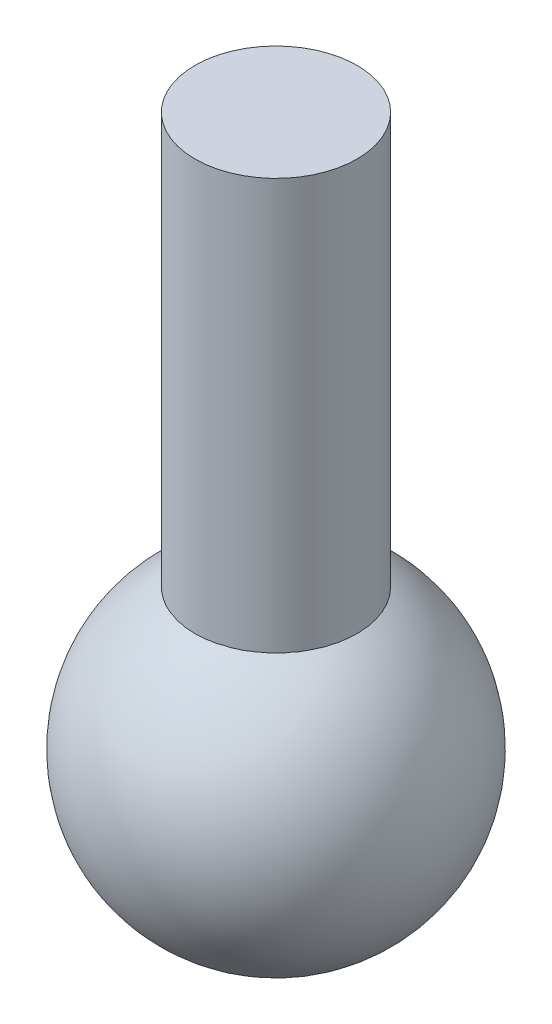
ISO-10303-21;
HEADER;
FILE_DESCRIPTION(('STEP AP214'),'2;1');
FILE_NAME('part.step','',(''),(''),'','','');
FILE_SCHEMA(('AUTOMOTIVE_DESIGN { 1 0 10303 214 1 1 1 1 }'));
ENDSEC;
DATA;
#1=APPLICATION_CONTEXT('core data for automotive mechanical design processes');
#2=APPLICATION_PROTOCOL_DEFINITION('international standard','automotive_design',2000,#1);
#3=PRODUCT_CONTEXT('',#1,'mechanical');
#4=PRODUCT('Part','Part','',(#3));
#5=PRODUCT_RELATED_PRODUCT_CATEGORY('part','',(#4));
#6=PRODUCT_DEFINITION_FORMATION('','',#4);
#7=PRODUCT_DEFINITION_CONTEXT('part definition',#1,'design');
#8=PRODUCT_DEFINITION('design','',#6,#7);
#9=PRODUCT_DEFINITION_SHAPE('','',#8);
#10=(LENGTH_UNIT() NAMED_UNIT(*) SI_UNIT(.MILLI.,.METRE.));
#11=(NAMED_UNIT(*) PLANE_ANGLE_UNIT() SI_UNIT($,.RADIAN.));
#12=(NAMED_UNIT(*) SI_UNIT($,.STERADIAN.) SOLID_ANGLE_UNIT());
#13=UNCERTAINTY_MEASURE_WITH_UNIT(LENGTH_MEASURE(1.E-05),#10,'distance_accuracy_value','');
#14=(GEOMETRIC_REPRESENTATION_CONTEXT(3) GLOBAL_UNCERTAINTY_ASSIGNED_CONTEXT((#13)) GLOBAL_UNIT_ASSIGNED_CONTEXT((#10,
#11,#12)) REPRESENTATION_CONTEXT('',''));
#15=CARTESIAN_POINT('',(0.,0.,0.));
#16=DIRECTION('',(0.,0.,1.));
#17=DIRECTION('',(1.,0.,0.));
#18=AXIS2_PLACEMENT_3D('',#15,#16,#17);
#19=CARTESIAN_POINT('',(0.,-26.,0.));
#20=DIRECTION('',(0.,0.,1.));
#21=DIRECTION('',(1.,0.,0.));
#22=AXIS2_PLACEMENT_3D('',#19,#20,#21);
#23=SPHERICAL_SURFACE('',#22,10.);
#24=CARTESIAN_POINT('',(0.,-26.,10.));
#25=VERTEX_POINT('',#24);
#26=VERTEX_LOOP('',#25);
#27=FACE_BOUND('',#26,.T.);
#28=ADVANCED_FACE('F43',(#27),#23,.T.);
#29=CLOSED_SHELL('',(#28));
#30=MANIFOLD_SOLID_BREP('B2',#29);
#31=CARTESIAN_POINT('',(0.,-26.,0.));
#32=DIRECTION('',(0.,1.,0.));
#33=DIRECTION('',(0.,0.,1.));
#34=AXIS2_PLACEMENT_3D('',#31,#32,#33);
#35=CYLINDRICAL_SURFACE('',#34,5.);
#36=CARTESIAN_POINT('',(0.,-26.,0.));
#37=DIRECTION('',(0.,1.,0.));
#38=DIRECTION('',(0.,0.,1.));
#39=AXIS2_PLACEMENT_3D('',#36,#37,#38);
#40=CIRCLE('',#39,5.);
#41=CARTESIAN_POINT('',(0.,-26.,5.));
#42=VERTEX_POINT('',#41);
#43=EDGE_CURVE('E42',#42,#42,#40,.T.);
#44=ORIENTED_EDGE('',*,*,#43,.T.);
#45=EDGE_LOOP('',(#44));
#46=FACE_BOUND('',#45,.T.);
#47=CARTESIAN_POINT('',(0.,8.,0.));
#48=DIRECTION('',(0.,1.,0.));
#49=DIRECTION('',(0.,0.,1.));
#50=AXIS2_PLACEMENT_3D('',#47,#48,#49);
#51=CIRCLE('',#50,5.);
#52=CARTESIAN_POINT('',(0.,8.,5.));
#53=VERTEX_POINT('',#52);
#54=EDGE_CURVE('E63',#53,#53,#51,.T.);
#55=ORIENTED_EDGE('',*,*,#54,.F.);
#56=EDGE_LOOP('',(#55));
#57=FACE_BOUND('',#56,.T.);
#58=ADVANCED_FACE('F56',(#46,#57),#35,.T.);
#59=CARTESIAN_POINT('',(0.,-26.,0.));
#60=DIRECTION('',(0.,1.,0.));
#61=DIRECTION('',(0.,0.,1.));
#62=AXIS2_PLACEMENT_3D('',#59,#60,#61);
#63=PLANE('',#62);
#64=ORIENTED_EDGE('',*,*,#43,.F.);
#65=EDGE_LOOP('',(#64));
#66=FACE_BOUND('',#65,.T.);
#67=ADVANCED_FACE('F71',(#66),#63,.F.);
#68=CARTESIAN_POINT('',(0.,8.,0.));
#69=DIRECTION('',(0.,1.,0.));
#70=DIRECTION('',(0.,0.,1.));
#71=AXIS2_PLACEMENT_3D('',#68,#69,#70);
#72=PLANE('',#71);
#73=ORIENTED_EDGE('',*,*,#54,.T.);
#74=EDGE_LOOP('',(#73));
#75=FACE_BOUND('',#74,.T.);
#76=ADVANCED_FACE('F58',(#75),#72,.T.);
#77=CLOSED_SHELL('',(#58,#67,#76));
#78=MANIFOLD_SOLID_BREP('B6',#77);
#79=ADVANCED_BREP_SHAPE_REPRESENTATION('',(#18,#30,#78),#14);
#80=SHAPE_DEFINITION_REPRESENTATION(#9,#79);
ENDSEC;
END-ISO-10303-21;
